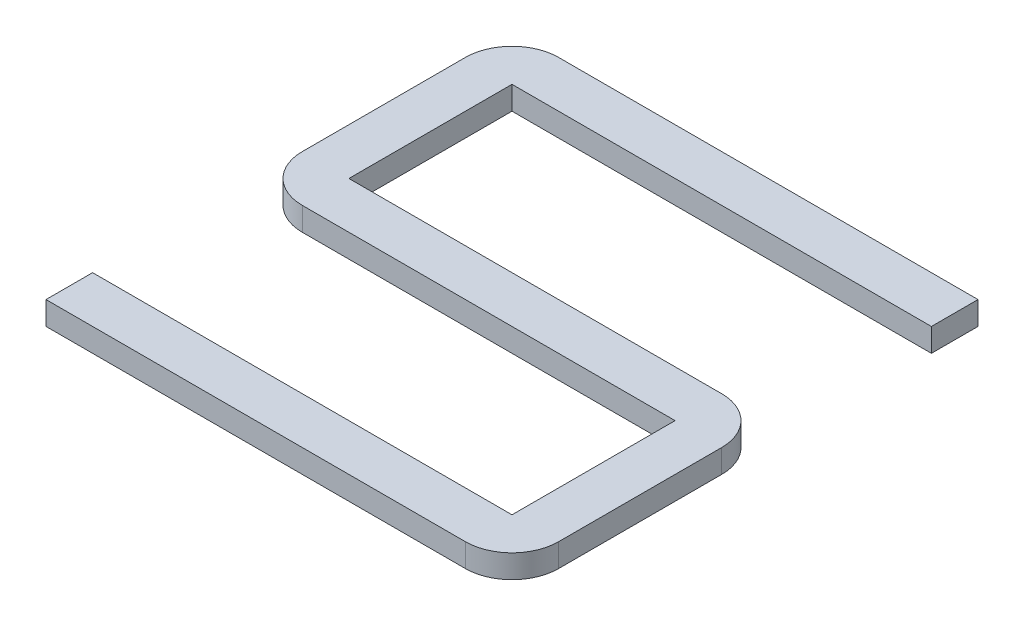
ISO-10303-21;
HEADER;
FILE_DESCRIPTION(('STEP AP214'),'2;1');
FILE_NAME('part.step','',(''),(''),'','','');
FILE_SCHEMA(('AUTOMOTIVE_DESIGN { 1 0 10303 214 1 1 1 1 }'));
ENDSEC;
DATA;
#1=APPLICATION_CONTEXT('core data for automotive mechanical design processes');
#2=APPLICATION_PROTOCOL_DEFINITION('international standard','automotive_design',2000,#1);
#3=PRODUCT_CONTEXT('',#1,'mechanical');
#4=PRODUCT('Part','Part','',(#3));
#5=PRODUCT_RELATED_PRODUCT_CATEGORY('part','',(#4));
#6=PRODUCT_DEFINITION_FORMATION('','',#4);
#7=PRODUCT_DEFINITION_CONTEXT('part definition',#1,'design');
#8=PRODUCT_DEFINITION('design','',#6,#7);
#9=PRODUCT_DEFINITION_SHAPE('','',#8);
#10=(LENGTH_UNIT() NAMED_UNIT(*) SI_UNIT(.MILLI.,.METRE.));
#11=(NAMED_UNIT(*) PLANE_ANGLE_UNIT() SI_UNIT($,.RADIAN.));
#12=(NAMED_UNIT(*) SI_UNIT($,.STERADIAN.) SOLID_ANGLE_UNIT());
#13=UNCERTAINTY_MEASURE_WITH_UNIT(LENGTH_MEASURE(1.E-05),#10,'distance_accuracy_value','');
#14=(GEOMETRIC_REPRESENTATION_CONTEXT(3) GLOBAL_UNCERTAINTY_ASSIGNED_CONTEXT((#13)) GLOBAL_UNIT_ASSIGNED_CONTEXT((#10,
#11,#12)) REPRESENTATION_CONTEXT('',''));
#15=CARTESIAN_POINT('',(0.,0.,0.));
#16=DIRECTION('',(0.,0.,1.));
#17=DIRECTION('',(1.,0.,0.));
#18=AXIS2_PLACEMENT_3D('',#15,#16,#17);
#19=CARTESIAN_POINT('',(-20.,2.,16.));
#20=DIRECTION('',(1.,0.,0.));
#21=DIRECTION('',(0.,0.,-1.));
#22=AXIS2_PLACEMENT_3D('',#19,#20,#21);
#23=PLANE('',#22);
#24=DIRECTION('',(0.,0.,1.));
#25=VECTOR('',#24,1.);
#26=CARTESIAN_POINT('',(-20.,0.,16.));
#27=LINE('',#26,#25);
#28=CARTESIAN_POINT('',(-20.,0.,16.));
#29=VERTEX_POINT('',#28);
#30=CARTESIAN_POINT('',(-20.,0.,20.));
#31=VERTEX_POINT('',#30);
#32=EDGE_CURVE('E192',#29,#31,#27,.T.);
#33=ORIENTED_EDGE('',*,*,#32,.T.);
#34=DIRECTION('',(0.,-1.,0.));
#35=VECTOR('',#34,1.);
#36=CARTESIAN_POINT('',(-20.,2.,20.));
#37=LINE('',#36,#35);
#38=CARTESIAN_POINT('',(-20.,2.,20.));
#39=VERTEX_POINT('',#38);
#40=EDGE_CURVE('E11',#39,#31,#37,.T.);
#41=ORIENTED_EDGE('',*,*,#40,.F.);
#42=DIRECTION('',(0.,0.,1.));
#43=VECTOR('',#42,1.);
#44=CARTESIAN_POINT('',(-20.,2.,16.));
#45=LINE('',#44,#43);
#46=CARTESIAN_POINT('',(-20.,2.,16.));
#47=VERTEX_POINT('',#46);
#48=EDGE_CURVE('E238',#47,#39,#45,.T.);
#49=ORIENTED_EDGE('',*,*,#48,.F.);
#50=DIRECTION('',(0.,-1.,0.));
#51=VECTOR('',#50,1.);
#52=CARTESIAN_POINT('',(-20.,2.,16.));
#53=LINE('',#52,#51);
#54=EDGE_CURVE('E188',#47,#29,#53,.T.);
#55=ORIENTED_EDGE('',*,*,#54,.T.);
#56=EDGE_LOOP('',(#33,#41,#49,#55));
#57=FACE_BOUND('',#56,.T.);
#58=ADVANCED_FACE('F43',(#57),#23,.F.);
#59=CARTESIAN_POINT('',(-20.,2.,20.));
#60=DIRECTION('',(0.,0.,-1.));
#61=DIRECTION('',(-1.,0.,0.));
#62=AXIS2_PLACEMENT_3D('',#59,#60,#61);
#63=PLANE('',#62);
#64=DIRECTION('',(1.,0.,0.));
#65=VECTOR('',#64,1.);
#66=CARTESIAN_POINT('',(-20.,0.,20.));
#67=LINE('',#66,#65);
#68=CARTESIAN_POINT('',(16.,0.,20.));
#69=VERTEX_POINT('',#68);
#70=EDGE_CURVE('E196',#31,#69,#67,.T.);
#71=ORIENTED_EDGE('',*,*,#70,.T.);
#72=DIRECTION('',(0.,-1.,0.));
#73=VECTOR('',#72,1.);
#74=CARTESIAN_POINT('',(16.,2.,20.));
#75=LINE('',#74,#73);
#76=CARTESIAN_POINT('',(16.,2.,20.));
#77=VERTEX_POINT('',#76);
#78=EDGE_CURVE('E52',#77,#69,#75,.T.);
#79=ORIENTED_EDGE('',*,*,#78,.F.);
#80=DIRECTION('',(1.,0.,0.));
#81=VECTOR('',#80,1.);
#82=CARTESIAN_POINT('',(-20.,2.,20.));
#83=LINE('',#82,#81);
#84=EDGE_CURVE('E127',#39,#77,#83,.T.);
#85=ORIENTED_EDGE('',*,*,#84,.F.);
#86=ORIENTED_EDGE('',*,*,#40,.T.);
#87=EDGE_LOOP('',(#71,#79,#85,#86));
#88=FACE_BOUND('',#87,.T.);
#89=ADVANCED_FACE('F360',(#88),#63,.F.);
#90=CARTESIAN_POINT('',(16.,2.,16.));
#91=DIRECTION('',(0.,-1.,0.));
#92=DIRECTION('',(0.,0.,-1.));
#93=AXIS2_PLACEMENT_3D('',#90,#91,#92);
#94=CYLINDRICAL_SURFACE('',#93,4.);
#95=CARTESIAN_POINT('',(16.,0.,16.));
#96=DIRECTION('',(0.,1.,0.));
#97=DIRECTION('',(0.,0.,1.));
#98=AXIS2_PLACEMENT_3D('',#95,#96,#97);
#99=CIRCLE('',#98,4.);
#100=CARTESIAN_POINT('',(20.,0.,16.));
#101=VERTEX_POINT('',#100);
#102=EDGE_CURVE('E199',#69,#101,#99,.T.);
#103=ORIENTED_EDGE('',*,*,#102,.T.);
#104=DIRECTION('',(0.,-1.,0.));
#105=VECTOR('',#104,1.);
#106=CARTESIAN_POINT('',(20.,2.,16.));
#107=LINE('',#106,#105);
#108=CARTESIAN_POINT('',(20.,2.,16.));
#109=VERTEX_POINT('',#108);
#110=EDGE_CURVE('E281',#109,#101,#107,.T.);
#111=ORIENTED_EDGE('',*,*,#110,.F.);
#112=CARTESIAN_POINT('',(16.,2.,16.));
#113=DIRECTION('',(0.,1.,0.));
#114=DIRECTION('',(0.,0.,1.));
#115=AXIS2_PLACEMENT_3D('',#112,#113,#114);
#116=CIRCLE('',#115,4.);
#117=EDGE_CURVE('E291',#77,#109,#116,.T.);
#118=ORIENTED_EDGE('',*,*,#117,.F.);
#119=ORIENTED_EDGE('',*,*,#78,.T.);
#120=EDGE_LOOP('',(#103,#111,#118,#119));
#121=FACE_BOUND('',#120,.T.);
#122=ADVANCED_FACE('F289',(#121),#94,.T.);
#123=CARTESIAN_POINT('',(20.,2.,2.));
#124=DIRECTION('',(-1.,0.,0.));
#125=DIRECTION('',(0.,0.,1.));
#126=AXIS2_PLACEMENT_3D('',#123,#124,#125);
#127=PLANE('',#126);
#128=DIRECTION('',(0.,0.,-1.));
#129=VECTOR('',#128,1.);
#130=CARTESIAN_POINT('',(20.,0.,2.));
#131=LINE('',#130,#129);
#132=CARTESIAN_POINT('',(20.,0.,2.));
#133=VERTEX_POINT('',#132);
#134=EDGE_CURVE('E202',#101,#133,#131,.T.);
#135=ORIENTED_EDGE('',*,*,#134,.T.);
#136=DIRECTION('',(0.,-1.,0.));
#137=VECTOR('',#136,1.);
#138=CARTESIAN_POINT('',(20.,2.,2.));
#139=LINE('',#138,#137);
#140=CARTESIAN_POINT('',(20.,2.,2.));
#141=VERTEX_POINT('',#140);
#142=EDGE_CURVE('E277',#141,#133,#139,.T.);
#143=ORIENTED_EDGE('',*,*,#142,.F.);
#144=DIRECTION('',(0.,0.,-1.));
#145=VECTOR('',#144,1.);
#146=CARTESIAN_POINT('',(20.,2.,2.));
#147=LINE('',#146,#145);
#148=EDGE_CURVE('E310',#109,#141,#147,.T.);
#149=ORIENTED_EDGE('',*,*,#148,.F.);
#150=ORIENTED_EDGE('',*,*,#110,.T.);
#151=EDGE_LOOP('',(#135,#143,#149,#150));
#152=FACE_BOUND('',#151,.T.);
#153=ADVANCED_FACE('F300',(#152),#127,.F.);
#154=CARTESIAN_POINT('',(16.,2.,2.));
#155=DIRECTION('',(0.,-1.,0.));
#156=DIRECTION('',(0.,0.,-1.));
#157=AXIS2_PLACEMENT_3D('',#154,#155,#156);
#158=CYLINDRICAL_SURFACE('',#157,4.00000000000001);
#159=CARTESIAN_POINT('',(16.,0.,2.));
#160=DIRECTION('',(0.,1.,0.));
#161=DIRECTION('',(0.,0.,-1.));
#162=AXIS2_PLACEMENT_3D('',#159,#160,#161);
#163=CIRCLE('',#162,4.00000000000001);
#164=CARTESIAN_POINT('',(16.,0.,-2.00000000000001));
#165=VERTEX_POINT('',#164);
#166=EDGE_CURVE('E205',#133,#165,#163,.T.);
#167=ORIENTED_EDGE('',*,*,#166,.T.);
#168=DIRECTION('',(0.,-1.,0.));
#169=VECTOR('',#168,1.);
#170=CARTESIAN_POINT('',(16.,2.,-2.00000000000001));
#171=LINE('',#170,#169);
#172=CARTESIAN_POINT('',(16.,2.,-2.00000000000001));
#173=VERTEX_POINT('',#172);
#174=EDGE_CURVE('E273',#173,#165,#171,.T.);
#175=ORIENTED_EDGE('',*,*,#174,.F.);
#176=CARTESIAN_POINT('',(16.,2.,2.));
#177=DIRECTION('',(0.,1.,0.));
#178=DIRECTION('',(0.,0.,-1.));
#179=AXIS2_PLACEMENT_3D('',#176,#177,#178);
#180=CIRCLE('',#179,4.00000000000001);
#181=EDGE_CURVE('E306',#141,#173,#180,.T.);
#182=ORIENTED_EDGE('',*,*,#181,.F.);
#183=ORIENTED_EDGE('',*,*,#142,.T.);
#184=EDGE_LOOP('',(#167,#175,#182,#183));
#185=FACE_BOUND('',#184,.T.);
#186=ADVANCED_FACE('F304',(#185),#158,.T.);
#187=CARTESIAN_POINT('',(-16.,2.,-2.));
#188=DIRECTION('',(0.,0.,1.));
#189=DIRECTION('',(1.,0.,0.));
#190=AXIS2_PLACEMENT_3D('',#187,#188,#189);
#191=PLANE('',#190);
#192=DIRECTION('',(-1.,0.,0.));
#193=VECTOR('',#192,1.);
#194=CARTESIAN_POINT('',(-16.,0.,-2.));
#195=LINE('',#194,#193);
#196=CARTESIAN_POINT('',(-16.,0.,-2.));
#197=VERTEX_POINT('',#196);
#198=EDGE_CURVE('E208',#165,#197,#195,.T.);
#199=ORIENTED_EDGE('',*,*,#198,.T.);
#200=DIRECTION('',(0.,-1.,0.));
#201=VECTOR('',#200,1.);
#202=CARTESIAN_POINT('',(-16.,2.,-2.));
#203=LINE('',#202,#201);
#204=CARTESIAN_POINT('',(-16.,2.,-2.));
#205=VERTEX_POINT('',#204);
#206=EDGE_CURVE('E269',#205,#197,#203,.T.);
#207=ORIENTED_EDGE('',*,*,#206,.F.);
#208=DIRECTION('',(-1.,0.,0.));
#209=VECTOR('',#208,1.);
#210=CARTESIAN_POINT('',(-16.,2.,-2.));
#211=LINE('',#210,#209);
#212=EDGE_CURVE('E309',#173,#205,#211,.T.);
#213=ORIENTED_EDGE('',*,*,#212,.F.);
#214=ORIENTED_EDGE('',*,*,#174,.T.);
#215=EDGE_LOOP('',(#199,#207,#213,#214));
#216=FACE_BOUND('',#215,.T.);
#217=ADVANCED_FACE('F373',(#216),#191,.F.);
#218=CARTESIAN_POINT('',(-16.,2.,-16.));
#219=DIRECTION('',(-1.,0.,0.));
#220=DIRECTION('',(0.,0.,1.));
#221=AXIS2_PLACEMENT_3D('',#218,#219,#220);
#222=PLANE('',#221);
#223=DIRECTION('',(0.,0.,-1.));
#224=VECTOR('',#223,1.);
#225=CARTESIAN_POINT('',(-16.,0.,-16.));
#226=LINE('',#225,#224);
#227=CARTESIAN_POINT('',(-16.,0.,-16.));
#228=VERTEX_POINT('',#227);
#229=EDGE_CURVE('E211',#197,#228,#226,.T.);
#230=ORIENTED_EDGE('',*,*,#229,.T.);
#231=DIRECTION('',(0.,-1.,0.));
#232=VECTOR('',#231,1.);
#233=CARTESIAN_POINT('',(-16.,2.,-16.));
#234=LINE('',#233,#232);
#235=CARTESIAN_POINT('',(-16.,2.,-16.));
#236=VERTEX_POINT('',#235);
#237=EDGE_CURVE('E265',#236,#228,#234,.T.);
#238=ORIENTED_EDGE('',*,*,#237,.F.);
#239=DIRECTION('',(0.,0.,-1.));
#240=VECTOR('',#239,1.);
#241=CARTESIAN_POINT('',(-16.,2.,-16.));
#242=LINE('',#241,#240);
#243=EDGE_CURVE('E314',#205,#236,#242,.T.);
#244=ORIENTED_EDGE('',*,*,#243,.F.);
#245=ORIENTED_EDGE('',*,*,#206,.T.);
#246=EDGE_LOOP('',(#230,#238,#244,#245));
#247=FACE_BOUND('',#246,.T.);
#248=ADVANCED_FACE('F376',(#247),#222,.F.);
#249=CARTESIAN_POINT('',(20.,2.,-16.));
#250=DIRECTION('',(0.,0.,-1.));
#251=DIRECTION('',(-1.,0.,0.));
#252=AXIS2_PLACEMENT_3D('',#249,#250,#251);
#253=PLANE('',#252);
#254=DIRECTION('',(1.,0.,0.));
#255=VECTOR('',#254,1.);
#256=CARTESIAN_POINT('',(20.,0.,-16.));
#257=LINE('',#256,#255);
#258=CARTESIAN_POINT('',(20.,0.,-16.));
#259=VERTEX_POINT('',#258);
#260=EDGE_CURVE('E214',#228,#259,#257,.T.);
#261=ORIENTED_EDGE('',*,*,#260,.T.);
#262=DIRECTION('',(0.,-1.,0.));
#263=VECTOR('',#262,1.);
#264=CARTESIAN_POINT('',(20.,2.,-16.));
#265=LINE('',#264,#263);
#266=CARTESIAN_POINT('',(20.,2.,-16.));
#267=VERTEX_POINT('',#266);
#268=EDGE_CURVE('E261',#267,#259,#265,.T.);
#269=ORIENTED_EDGE('',*,*,#268,.F.);
#270=DIRECTION('',(1.,0.,0.));
#271=VECTOR('',#270,1.);
#272=CARTESIAN_POINT('',(20.,2.,-16.));
#273=LINE('',#272,#271);
#274=EDGE_CURVE('E321',#236,#267,#273,.T.);
#275=ORIENTED_EDGE('',*,*,#274,.F.);
#276=ORIENTED_EDGE('',*,*,#237,.T.);
#277=EDGE_LOOP('',(#261,#269,#275,#276));
#278=FACE_BOUND('',#277,.T.);
#279=ADVANCED_FACE('F380',(#278),#253,.F.);
#280=CARTESIAN_POINT('',(20.,2.,-20.));
#281=DIRECTION('',(-1.,0.,0.));
#282=DIRECTION('',(0.,0.,1.));
#283=AXIS2_PLACEMENT_3D('',#280,#281,#282);
#284=PLANE('',#283);
#285=DIRECTION('',(0.,0.,-1.));
#286=VECTOR('',#285,1.);
#287=CARTESIAN_POINT('',(20.,0.,-20.));
#288=LINE('',#287,#286);
#289=CARTESIAN_POINT('',(20.,0.,-20.));
#290=VERTEX_POINT('',#289);
#291=EDGE_CURVE('E217',#259,#290,#288,.T.);
#292=ORIENTED_EDGE('',*,*,#291,.T.);
#293=DIRECTION('',(0.,-1.,0.));
#294=VECTOR('',#293,1.);
#295=CARTESIAN_POINT('',(20.,2.,-20.));
#296=LINE('',#295,#294);
#297=CARTESIAN_POINT('',(20.,2.,-20.));
#298=VERTEX_POINT('',#297);
#299=EDGE_CURVE('E257',#298,#290,#296,.T.);
#300=ORIENTED_EDGE('',*,*,#299,.F.);
#301=DIRECTION('',(0.,0.,-1.));
#302=VECTOR('',#301,1.);
#303=CARTESIAN_POINT('',(20.,2.,-20.));
#304=LINE('',#303,#302);
#305=EDGE_CURVE('E324',#267,#298,#304,.T.);
#306=ORIENTED_EDGE('',*,*,#305,.F.);
#307=ORIENTED_EDGE('',*,*,#268,.T.);
#308=EDGE_LOOP('',(#292,#300,#306,#307));
#309=FACE_BOUND('',#308,.T.);
#310=ADVANCED_FACE('F384',(#309),#284,.F.);
#311=CARTESIAN_POINT('',(-16.,2.,-20.));
#312=DIRECTION('',(0.,0.,1.));
#313=DIRECTION('',(1.,0.,0.));
#314=AXIS2_PLACEMENT_3D('',#311,#312,#313);
#315=PLANE('',#314);
#316=DIRECTION('',(-1.,0.,0.));
#317=VECTOR('',#316,1.);
#318=CARTESIAN_POINT('',(-16.,0.,-20.));
#319=LINE('',#318,#317);
#320=CARTESIAN_POINT('',(-16.,0.,-20.));
#321=VERTEX_POINT('',#320);
#322=EDGE_CURVE('E220',#290,#321,#319,.T.);
#323=ORIENTED_EDGE('',*,*,#322,.T.);
#324=DIRECTION('',(0.,-1.,0.));
#325=VECTOR('',#324,1.);
#326=CARTESIAN_POINT('',(-16.,2.,-20.));
#327=LINE('',#326,#325);
#328=CARTESIAN_POINT('',(-16.,2.,-20.));
#329=VERTEX_POINT('',#328);
#330=EDGE_CURVE('E253',#329,#321,#327,.T.);
#331=ORIENTED_EDGE('',*,*,#330,.F.);
#332=DIRECTION('',(-1.,0.,0.));
#333=VECTOR('',#332,1.);
#334=CARTESIAN_POINT('',(-16.,2.,-20.));
#335=LINE('',#334,#333);
#336=EDGE_CURVE('E327',#298,#329,#335,.T.);
#337=ORIENTED_EDGE('',*,*,#336,.F.);
#338=ORIENTED_EDGE('',*,*,#299,.T.);
#339=EDGE_LOOP('',(#323,#331,#337,#338));
#340=FACE_BOUND('',#339,.T.);
#341=ADVANCED_FACE('F388',(#340),#315,.F.);
#342=CARTESIAN_POINT('',(-16.,2.,-16.));
#343=DIRECTION('',(0.,-1.,0.));
#344=DIRECTION('',(0.,0.,-1.));
#345=AXIS2_PLACEMENT_3D('',#342,#343,#344);
#346=CYLINDRICAL_SURFACE('',#345,4.);
#347=CARTESIAN_POINT('',(-16.,0.,-16.));
#348=DIRECTION('',(0.,1.,0.));
#349=DIRECTION('',(0.,0.,1.));
#350=AXIS2_PLACEMENT_3D('',#347,#348,#349);
#351=CIRCLE('',#350,4.);
#352=CARTESIAN_POINT('',(-20.,0.,-16.));
#353=VERTEX_POINT('',#352);
#354=EDGE_CURVE('E223',#321,#353,#351,.T.);
#355=ORIENTED_EDGE('',*,*,#354,.T.);
#356=DIRECTION('',(0.,-1.,0.));
#357=VECTOR('',#356,1.);
#358=CARTESIAN_POINT('',(-20.,2.,-16.));
#359=LINE('',#358,#357);
#360=CARTESIAN_POINT('',(-20.,2.,-16.));
#361=VERTEX_POINT('',#360);
#362=EDGE_CURVE('E249',#361,#353,#359,.T.);
#363=ORIENTED_EDGE('',*,*,#362,.F.);
#364=CARTESIAN_POINT('',(-16.,2.,-16.));
#365=DIRECTION('',(0.,1.,0.));
#366=DIRECTION('',(0.,0.,1.));
#367=AXIS2_PLACEMENT_3D('',#364,#365,#366);
#368=CIRCLE('',#367,4.);
#369=EDGE_CURVE('E330',#329,#361,#368,.T.);
#370=ORIENTED_EDGE('',*,*,#369,.F.);
#371=ORIENTED_EDGE('',*,*,#330,.T.);
#372=EDGE_LOOP('',(#355,#363,#370,#371));
#373=FACE_BOUND('',#372,.T.);
#374=ADVANCED_FACE('F392',(#373),#346,.T.);
#375=CARTESIAN_POINT('',(-20.,2.,-16.));
#376=DIRECTION('',(1.,0.,0.));
#377=DIRECTION('',(0.,0.,-1.));
#378=AXIS2_PLACEMENT_3D('',#375,#376,#377);
#379=PLANE('',#378);
#380=DIRECTION('',(0.,0.,1.));
#381=VECTOR('',#380,1.);
#382=CARTESIAN_POINT('',(-20.,0.,-16.));
#383=LINE('',#382,#381);
#384=CARTESIAN_POINT('',(-20.,0.,-2.));
#385=VERTEX_POINT('',#384);
#386=EDGE_CURVE('E226',#353,#385,#383,.T.);
#387=ORIENTED_EDGE('',*,*,#386,.T.);
#388=DIRECTION('',(0.,-1.,0.));
#389=VECTOR('',#388,1.);
#390=CARTESIAN_POINT('',(-20.,2.,-2.));
#391=LINE('',#390,#389);
#392=CARTESIAN_POINT('',(-20.,2.,-2.));
#393=VERTEX_POINT('',#392);
#394=EDGE_CURVE('E245',#393,#385,#391,.T.);
#395=ORIENTED_EDGE('',*,*,#394,.F.);
#396=DIRECTION('',(0.,0.,1.));
#397=VECTOR('',#396,1.);
#398=CARTESIAN_POINT('',(-20.,2.,-16.));
#399=LINE('',#398,#397);
#400=EDGE_CURVE('E333',#361,#393,#399,.T.);
#401=ORIENTED_EDGE('',*,*,#400,.F.);
#402=ORIENTED_EDGE('',*,*,#362,.T.);
#403=EDGE_LOOP('',(#387,#395,#401,#402));
#404=FACE_BOUND('',#403,.T.);
#405=ADVANCED_FACE('F341',(#404),#379,.F.);
#406=CARTESIAN_POINT('',(-16.,2.,-2.));
#407=DIRECTION('',(0.,-1.,0.));
#408=DIRECTION('',(0.,0.,-1.));
#409=AXIS2_PLACEMENT_3D('',#406,#407,#408);
#410=CYLINDRICAL_SURFACE('',#409,4.);
#411=CARTESIAN_POINT('',(-16.,0.,-2.));
#412=DIRECTION('',(0.,1.,0.));
#413=DIRECTION('',(0.,0.,1.));
#414=AXIS2_PLACEMENT_3D('',#411,#412,#413);
#415=CIRCLE('',#414,4.);
#416=CARTESIAN_POINT('',(-16.,0.,1.99999999999999));
#417=VERTEX_POINT('',#416);
#418=EDGE_CURVE('E229',#385,#417,#415,.T.);
#419=ORIENTED_EDGE('',*,*,#418,.T.);
#420=DIRECTION('',(0.,-1.,0.));
#421=VECTOR('',#420,1.);
#422=CARTESIAN_POINT('',(-16.,2.,1.99999999999999));
#423=LINE('',#422,#421);
#424=CARTESIAN_POINT('',(-16.,2.,1.99999999999999));
#425=VERTEX_POINT('',#424);
#426=EDGE_CURVE('E181',#425,#417,#423,.T.);
#427=ORIENTED_EDGE('',*,*,#426,.F.);
#428=CARTESIAN_POINT('',(-16.,2.,-2.));
#429=DIRECTION('',(0.,1.,0.));
#430=DIRECTION('',(0.,0.,1.));
#431=AXIS2_PLACEMENT_3D('',#428,#429,#430);
#432=CIRCLE('',#431,4.);
#433=EDGE_CURVE('E170',#393,#425,#432,.T.);
#434=ORIENTED_EDGE('',*,*,#433,.F.);
#435=ORIENTED_EDGE('',*,*,#394,.T.);
#436=EDGE_LOOP('',(#419,#427,#434,#435));
#437=FACE_BOUND('',#436,.T.);
#438=ADVANCED_FACE('F345',(#437),#410,.T.);
#439=CARTESIAN_POINT('',(16.,2.,2.));
#440=DIRECTION('',(0.,0.,-1.));
#441=DIRECTION('',(-1.,0.,0.));
#442=AXIS2_PLACEMENT_3D('',#439,#440,#441);
#443=PLANE('',#442);
#444=DIRECTION('',(1.,0.,0.));
#445=VECTOR('',#444,1.);
#446=CARTESIAN_POINT('',(16.,0.,2.));
#447=LINE('',#446,#445);
#448=CARTESIAN_POINT('',(16.,0.,2.));
#449=VERTEX_POINT('',#448);
#450=EDGE_CURVE('E179',#417,#449,#447,.T.);
#451=ORIENTED_EDGE('',*,*,#450,.T.);
#452=DIRECTION('',(0.,-1.,0.));
#453=VECTOR('',#452,1.);
#454=CARTESIAN_POINT('',(16.,2.,2.));
#455=LINE('',#454,#453);
#456=CARTESIAN_POINT('',(16.,2.,2.));
#457=VERTEX_POINT('',#456);
#458=EDGE_CURVE('E176',#457,#449,#455,.T.);
#459=ORIENTED_EDGE('',*,*,#458,.F.);
#460=DIRECTION('',(1.,0.,0.));
#461=VECTOR('',#460,1.);
#462=CARTESIAN_POINT('',(16.,2.,2.));
#463=LINE('',#462,#461);
#464=EDGE_CURVE('E164',#425,#457,#463,.T.);
#465=ORIENTED_EDGE('',*,*,#464,.F.);
#466=ORIENTED_EDGE('',*,*,#426,.T.);
#467=EDGE_LOOP('',(#451,#459,#465,#466));
#468=FACE_BOUND('',#467,.T.);
#469=ADVANCED_FACE('F177',(#468),#443,.F.);
#470=CARTESIAN_POINT('',(16.,2.,2.));
#471=DIRECTION('',(1.,0.,0.));
#472=DIRECTION('',(0.,0.,-1.));
#473=AXIS2_PLACEMENT_3D('',#470,#471,#472);
#474=PLANE('',#473);
#475=DIRECTION('',(0.,0.,1.));
#476=VECTOR('',#475,1.);
#477=CARTESIAN_POINT('',(16.,0.,2.));
#478=LINE('',#477,#476);
#479=CARTESIAN_POINT('',(16.,0.,16.));
#480=VERTEX_POINT('',#479);
#481=EDGE_CURVE('E113',#449,#480,#478,.T.);
#482=ORIENTED_EDGE('',*,*,#481,.T.);
#483=DIRECTION('',(0.,-1.,0.));
#484=VECTOR('',#483,1.);
#485=CARTESIAN_POINT('',(16.,2.,16.));
#486=LINE('',#485,#484);
#487=CARTESIAN_POINT('',(16.,2.,16.));
#488=VERTEX_POINT('',#487);
#489=EDGE_CURVE('E182',#488,#480,#486,.T.);
#490=ORIENTED_EDGE('',*,*,#489,.F.);
#491=DIRECTION('',(0.,0.,1.));
#492=VECTOR('',#491,1.);
#493=CARTESIAN_POINT('',(16.,2.,2.));
#494=LINE('',#493,#492);
#495=EDGE_CURVE('E168',#457,#488,#494,.T.);
#496=ORIENTED_EDGE('',*,*,#495,.F.);
#497=ORIENTED_EDGE('',*,*,#458,.T.);
#498=EDGE_LOOP('',(#482,#490,#496,#497));
#499=FACE_BOUND('',#498,.T.);
#500=ADVANCED_FACE('F184',(#499),#474,.F.);
#501=CARTESIAN_POINT('',(16.,2.,16.));
#502=DIRECTION('',(0.,0.,1.));
#503=DIRECTION('',(1.,0.,0.));
#504=AXIS2_PLACEMENT_3D('',#501,#502,#503);
#505=PLANE('',#504);
#506=DIRECTION('',(-1.,0.,0.));
#507=VECTOR('',#506,1.);
#508=CARTESIAN_POINT('',(16.,0.,16.));
#509=LINE('',#508,#507);
#510=EDGE_CURVE('E119',#480,#29,#509,.T.);
#511=ORIENTED_EDGE('',*,*,#510,.T.);
#512=ORIENTED_EDGE('',*,*,#54,.F.);
#513=DIRECTION('',(-1.,0.,0.));
#514=VECTOR('',#513,1.);
#515=CARTESIAN_POINT('',(16.,2.,16.));
#516=LINE('',#515,#514);
#517=EDGE_CURVE('E60',#488,#47,#516,.T.);
#518=ORIENTED_EDGE('',*,*,#517,.F.);
#519=ORIENTED_EDGE('',*,*,#489,.T.);
#520=EDGE_LOOP('',(#511,#512,#518,#519));
#521=FACE_BOUND('',#520,.T.);
#522=ADVANCED_FACE('F349',(#521),#505,.F.);
#523=CARTESIAN_POINT('',(16.,2.,16.));
#524=DIRECTION('',(0.,1.,0.));
#525=DIRECTION('',(0.,0.,1.));
#526=AXIS2_PLACEMENT_3D('',#523,#524,#525);
#527=PLANE('',#526);
#528=ORIENTED_EDGE('',*,*,#48,.T.);
#529=ORIENTED_EDGE('',*,*,#84,.T.);
#530=ORIENTED_EDGE('',*,*,#117,.T.);
#531=ORIENTED_EDGE('',*,*,#148,.T.);
#532=ORIENTED_EDGE('',*,*,#181,.T.);
#533=ORIENTED_EDGE('',*,*,#212,.T.);
#534=ORIENTED_EDGE('',*,*,#243,.T.);
#535=ORIENTED_EDGE('',*,*,#274,.T.);
#536=ORIENTED_EDGE('',*,*,#305,.T.);
#537=ORIENTED_EDGE('',*,*,#336,.T.);
#538=ORIENTED_EDGE('',*,*,#369,.T.);
#539=ORIENTED_EDGE('',*,*,#400,.T.);
#540=ORIENTED_EDGE('',*,*,#433,.T.);
#541=ORIENTED_EDGE('',*,*,#464,.T.);
#542=ORIENTED_EDGE('',*,*,#495,.T.);
#543=ORIENTED_EDGE('',*,*,#517,.T.);
#544=EDGE_LOOP('',(#528,#529,#530,#531,#532,#533,#534,#535,#536,#537,#538,#539,#540,#541,#542,#543));
#545=FACE_BOUND('',#544,.T.);
#546=ADVANCED_FACE('F166',(#545),#527,.T.);
#547=CARTESIAN_POINT('',(16.,0.,16.));
#548=DIRECTION('',(0.,1.,0.));
#549=DIRECTION('',(0.,0.,1.));
#550=AXIS2_PLACEMENT_3D('',#547,#548,#549);
#551=PLANE('',#550);
#552=ORIENTED_EDGE('',*,*,#32,.F.);
#553=ORIENTED_EDGE('',*,*,#510,.F.);
#554=ORIENTED_EDGE('',*,*,#481,.F.);
#555=ORIENTED_EDGE('',*,*,#450,.F.);
#556=ORIENTED_EDGE('',*,*,#418,.F.);
#557=ORIENTED_EDGE('',*,*,#386,.F.);
#558=ORIENTED_EDGE('',*,*,#354,.F.);
#559=ORIENTED_EDGE('',*,*,#322,.F.);
#560=ORIENTED_EDGE('',*,*,#291,.F.);
#561=ORIENTED_EDGE('',*,*,#260,.F.);
#562=ORIENTED_EDGE('',*,*,#229,.F.);
#563=ORIENTED_EDGE('',*,*,#198,.F.);
#564=ORIENTED_EDGE('',*,*,#166,.F.);
#565=ORIENTED_EDGE('',*,*,#134,.F.);
#566=ORIENTED_EDGE('',*,*,#102,.F.);
#567=ORIENTED_EDGE('',*,*,#70,.F.);
#568=EDGE_LOOP('',(#552,#553,#554,#555,#556,#557,#558,#559,#560,#561,#562,#563,#564,#565,#566,#567));
#569=FACE_BOUND('',#568,.T.);
#570=ADVANCED_FACE('F295',(#569),#551,.F.);
#571=CLOSED_SHELL('',(#58,#89,#122,#153,#186,#217,#248,#279,#310,#341,#374,#405,#438,#469,#500,
#522,#546,#570));
#572=MANIFOLD_SOLID_BREP('B2',#571);
#573=ADVANCED_BREP_SHAPE_REPRESENTATION('',(#18,#572),#14);
#574=SHAPE_DEFINITION_REPRESENTATION(#9,#573);
ENDSEC;
END-ISO-10303-21;
